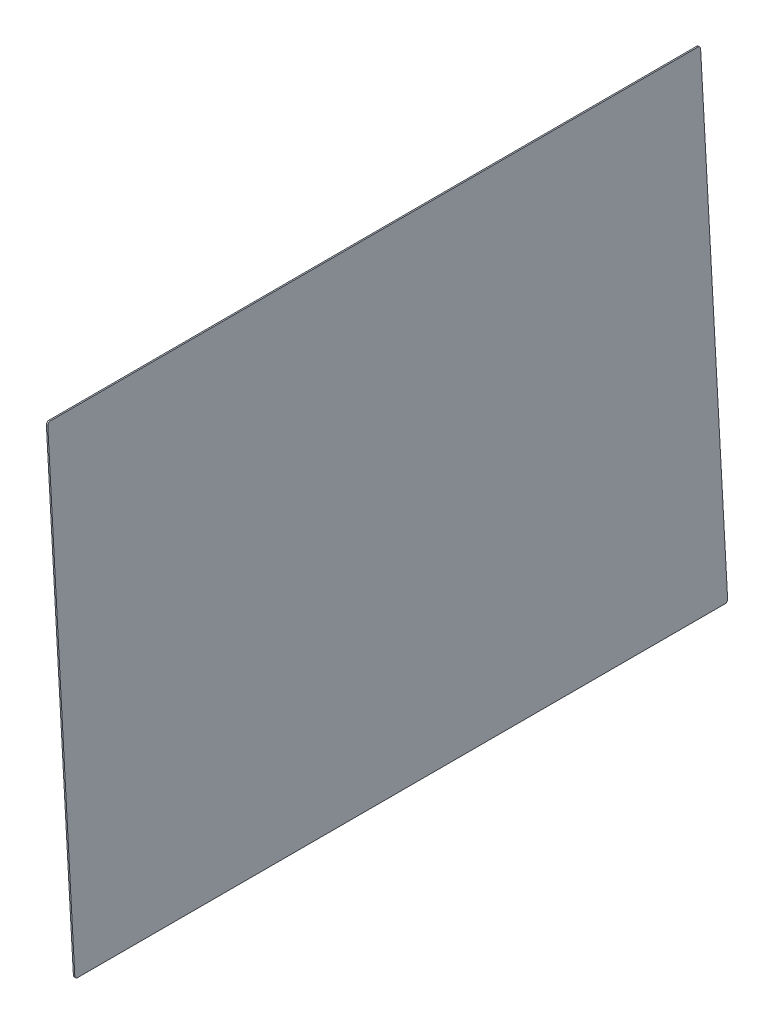
ISO-10303-21;
HEADER;
FILE_DESCRIPTION(('STEP AP214'),'2;1');
FILE_NAME('part.step','',(''),(''),'','','');
FILE_SCHEMA(('AUTOMOTIVE_DESIGN { 1 0 10303 214 1 1 1 1 }'));
ENDSEC;
DATA;
#1=APPLICATION_CONTEXT('core data for automotive mechanical design processes');
#2=APPLICATION_PROTOCOL_DEFINITION('international standard','automotive_design',2000,#1);
#3=PRODUCT_CONTEXT('',#1,'mechanical');
#4=PRODUCT('Part','Part','',(#3));
#5=PRODUCT_RELATED_PRODUCT_CATEGORY('part','',(#4));
#6=PRODUCT_DEFINITION_FORMATION('','',#4);
#7=PRODUCT_DEFINITION_CONTEXT('part definition',#1,'design');
#8=PRODUCT_DEFINITION('design','',#6,#7);
#9=PRODUCT_DEFINITION_SHAPE('','',#8);
#10=(LENGTH_UNIT() NAMED_UNIT(*) SI_UNIT(.MILLI.,.METRE.));
#11=(NAMED_UNIT(*) PLANE_ANGLE_UNIT() SI_UNIT($,.RADIAN.));
#12=(NAMED_UNIT(*) SI_UNIT($,.STERADIAN.) SOLID_ANGLE_UNIT());
#13=UNCERTAINTY_MEASURE_WITH_UNIT(LENGTH_MEASURE(1.E-05),#10,'distance_accuracy_value','');
#14=(GEOMETRIC_REPRESENTATION_CONTEXT(3) GLOBAL_UNCERTAINTY_ASSIGNED_CONTEXT((#13)) GLOBAL_UNIT_ASSIGNED_CONTEXT((#10,
#11,#12)) REPRESENTATION_CONTEXT('',''));
#15=CARTESIAN_POINT('',(0.,0.,0.));
#16=DIRECTION('',(0.,0.,1.));
#17=DIRECTION('',(1.,0.,0.));
#18=AXIS2_PLACEMENT_3D('',#15,#16,#17);
#19=CARTESIAN_POINT('',(-763.775566545537,-171.438463791411,-133.95));
#20=DIRECTION('',(0.998302940921257,0.0582343382204067,0.));
#21=DIRECTION('',(-0.0582343382204067,0.998302940921257,0.));
#22=AXIS2_PLACEMENT_3D('',#19,#20,#21);
#23=PLANE('',#22);
#24=DIRECTION('',(0.058234338220408,-0.998302940921257,0.));
#25=VECTOR('',#24,1.);
#26=CARTESIAN_POINT('',(-795.6297495521,374.633244892517,240.3));
#27=LINE('',#26,#25);
#28=CARTESIAN_POINT('',(-795.6297495521,374.633244892517,240.3));
#29=VERTEX_POINT('',#28);
#30=CARTESIAN_POINT('',(-764.649081618843,-156.463919677592,240.3));
#31=VERTEX_POINT('',#30);
#32=EDGE_CURVE('E112',#29,#31,#27,.T.);
#33=ORIENTED_EDGE('',*,*,#32,.T.);
#34=CARTESIAN_POINT('',(-764.649081618843,-156.463919677592,237.3));
#35=DIRECTION('',(0.998302940921257,0.0582343382204067,0.));
#36=DIRECTION('',(-0.0582343382204067,0.998302940921257,0.));
#37=AXIS2_PLACEMENT_3D('',#34,#35,#36);
#38=CIRCLE('',#37,3.);
#39=CARTESIAN_POINT('',(-764.474378604182,-159.458828500356,237.3));
#40=VERTEX_POINT('',#39);
#41=EDGE_CURVE('E138',#40,#31,#38,.F.);
#42=ORIENTED_EDGE('',*,*,#41,.F.);
#43=DIRECTION('',(0.,0.,1.));
#44=VECTOR('',#43,1.);
#45=CARTESIAN_POINT('',(-764.474378604182,-159.458828500356,-512.2));
#46=LINE('',#45,#44);
#47=CARTESIAN_POINT('',(-764.474378604182,-159.458828500356,-505.2));
#48=VERTEX_POINT('',#47);
#49=EDGE_CURVE('E92',#40,#48,#46,.F.);
#50=ORIENTED_EDGE('',*,*,#49,.T.);
#51=CARTESIAN_POINT('',(-764.649081618843,-156.463919677592,-505.2));
#52=DIRECTION('',(-0.998302940921257,-0.0582343382204067,0.));
#53=DIRECTION('',(0.0582343382204067,-0.998302940921257,0.));
#54=AXIS2_PLACEMENT_3D('',#51,#52,#53);
#55=CIRCLE('',#54,3.);
#56=CARTESIAN_POINT('',(-764.649081618843,-156.463919677592,-508.2));
#57=VERTEX_POINT('',#56);
#58=EDGE_CURVE('E19',#57,#48,#55,.T.);
#59=ORIENTED_EDGE('',*,*,#58,.F.);
#60=DIRECTION('',(-0.058234338220408,0.998302940921257,0.));
#61=VECTOR('',#60,1.);
#62=CARTESIAN_POINT('',(-764.649081618843,-156.463919677592,-508.2));
#63=LINE('',#62,#61);
#64=CARTESIAN_POINT('',(-795.6297495521,374.633244892517,-508.2));
#65=VERTEX_POINT('',#64);
#66=EDGE_CURVE('E78',#57,#65,#63,.T.);
#67=ORIENTED_EDGE('',*,*,#66,.T.);
#68=CARTESIAN_POINT('',(-795.6297495521,374.633244892517,-505.2));
#69=DIRECTION('',(0.998302940921257,0.0582343382204067,0.));
#70=DIRECTION('',(-0.0582343382204067,0.998302940921257,0.));
#71=AXIS2_PLACEMENT_3D('',#68,#69,#70);
#72=CIRCLE('',#71,3.);
#73=CARTESIAN_POINT('',(-795.804452566761,377.62815371528,-505.2));
#74=VERTEX_POINT('',#73);
#75=EDGE_CURVE('E105',#74,#65,#72,.F.);
#76=ORIENTED_EDGE('',*,*,#75,.F.);
#77=DIRECTION('',(0.,0.,1.));
#78=VECTOR('',#77,1.);
#79=CARTESIAN_POINT('',(-795.804452566761,377.62815371528,244.3));
#80=LINE('',#79,#78);
#81=CARTESIAN_POINT('',(-795.804452566761,377.62815371528,237.3));
#82=VERTEX_POINT('',#81);
#83=EDGE_CURVE('E117',#74,#82,#80,.T.);
#84=ORIENTED_EDGE('',*,*,#83,.T.);
#85=CARTESIAN_POINT('',(-795.6297495521,374.633244892517,237.3));
#86=DIRECTION('',(-0.998302940921257,-0.0582343382204067,0.));
#87=DIRECTION('',(0.0582343382204067,-0.998302940921257,0.));
#88=AXIS2_PLACEMENT_3D('',#85,#86,#87);
#89=CIRCLE('',#88,3.);
#90=EDGE_CURVE('E119',#29,#82,#89,.T.);
#91=ORIENTED_EDGE('',*,*,#90,.F.);
#92=EDGE_LOOP('',(#33,#42,#50,#59,#67,#76,#84,#91));
#93=FACE_BOUND('',#92,.T.);
#94=ADVANCED_FACE('F16',(#93),#23,.T.);
#95=CARTESIAN_POINT('',(-764.649081618843,-156.463919677592,-505.2));
#96=DIRECTION('',(-0.998302940921257,-0.0582343382204067,0.));
#97=DIRECTION('',(0.0582343382204067,-0.998302940921257,0.));
#98=AXIS2_PLACEMENT_3D('',#95,#96,#97);
#99=CYLINDRICAL_SURFACE('',#98,3.);
#100=DIRECTION('',(-0.998302940921257,-0.0582343382204067,0.));
#101=VECTOR('',#100,1.);
#102=CARTESIAN_POINT('',(-764.474378604182,-159.458828500356,-505.2));
#103=LINE('',#102,#101);
#104=CARTESIAN_POINT('',(-766.071663309656,-159.552003441509,-505.2));
#105=VERTEX_POINT('',#104);
#106=EDGE_CURVE('E111',#48,#105,#103,.T.);
#107=ORIENTED_EDGE('',*,*,#106,.T.);
#108=CARTESIAN_POINT('',(-766.246366324317,-156.557094618745,-505.2));
#109=DIRECTION('',(-0.998302940921257,-0.0582343382204067,0.));
#110=DIRECTION('',(0.0582343382204067,-0.998302940921257,0.));
#111=AXIS2_PLACEMENT_3D('',#108,#109,#110);
#112=CIRCLE('',#111,3.);
#113=CARTESIAN_POINT('',(-766.246366324317,-156.557094618745,-508.2));
#114=VERTEX_POINT('',#113);
#115=EDGE_CURVE('E99',#105,#114,#112,.F.);
#116=ORIENTED_EDGE('',*,*,#115,.T.);
#117=DIRECTION('',(0.998302940921248,0.0582343382205611,0.));
#118=VECTOR('',#117,1.);
#119=CARTESIAN_POINT('',(-766.246366324317,-156.557094618745,-508.2));
#120=LINE('',#119,#118);
#121=EDGE_CURVE('E83',#114,#57,#120,.T.);
#122=ORIENTED_EDGE('',*,*,#121,.T.);
#123=ORIENTED_EDGE('',*,*,#58,.T.);
#124=EDGE_LOOP('',(#107,#116,#122,#123));
#125=FACE_BOUND('',#124,.T.);
#126=ADVANCED_FACE('F98',(#125),#99,.T.);
#127=CARTESIAN_POINT('',(-796.386795948965,387.611183124493,-508.2));
#128=DIRECTION('',(0.,0.,1.));
#129=DIRECTION('',(1.,0.,0.));
#130=AXIS2_PLACEMENT_3D('',#127,#128,#129);
#131=PLANE('',#130);
#132=DIRECTION('',(-0.0582343382204067,0.998302940921257,0.));
#133=VECTOR('',#132,1.);
#134=CARTESIAN_POINT('',(-765.372851251011,-171.531638732564,-508.2));
#135=LINE('',#134,#133);
#136=CARTESIAN_POINT('',(-797.227034257574,374.540069951364,-508.2));
#137=VERTEX_POINT('',#136);
#138=EDGE_CURVE('E135',#114,#137,#135,.T.);
#139=ORIENTED_EDGE('',*,*,#138,.T.);
#140=DIRECTION('',(0.998302940921257,0.0582343382204067,0.));
#141=VECTOR('',#140,1.);
#142=CARTESIAN_POINT('',(-795.6297495521,374.633244892517,-508.2));
#143=LINE('',#142,#141);
#144=EDGE_CURVE('E85',#65,#137,#143,.F.);
#145=ORIENTED_EDGE('',*,*,#144,.F.);
#146=ORIENTED_EDGE('',*,*,#66,.F.);
#147=ORIENTED_EDGE('',*,*,#121,.F.);
#148=EDGE_LOOP('',(#139,#145,#146,#147));
#149=FACE_BOUND('',#148,.T.);
#150=ADVANCED_FACE('F81',(#149),#131,.F.);
#151=CARTESIAN_POINT('',(-795.6297495521,374.633244892517,-505.2));
#152=DIRECTION('',(0.998302940921257,0.0582343382204067,0.));
#153=DIRECTION('',(-0.0582343382204067,0.998302940921257,0.));
#154=AXIS2_PLACEMENT_3D('',#151,#152,#153);
#155=CYLINDRICAL_SURFACE('',#154,3.);
#156=DIRECTION('',(0.998302940921257,0.0582343382204067,0.));
#157=VECTOR('',#156,1.);
#158=CARTESIAN_POINT('',(-795.804452566761,377.62815371528,-505.2));
#159=LINE('',#158,#157);
#160=CARTESIAN_POINT('',(-797.401737272235,377.534978774128,-505.2));
#161=VERTEX_POINT('',#160);
#162=EDGE_CURVE('E120',#161,#74,#159,.T.);
#163=ORIENTED_EDGE('',*,*,#162,.T.);
#164=ORIENTED_EDGE('',*,*,#75,.T.);
#165=ORIENTED_EDGE('',*,*,#144,.T.);
#166=CARTESIAN_POINT('',(-797.227034257574,374.540069951364,-505.2));
#167=DIRECTION('',(0.998302940921257,0.0582343382204067,0.));
#168=DIRECTION('',(-0.0582343382204067,0.998302940921257,0.));
#169=AXIS2_PLACEMENT_3D('',#166,#167,#168);
#170=CIRCLE('',#169,3.);
#171=EDGE_CURVE('E131',#137,#161,#170,.T.);
#172=ORIENTED_EDGE('',*,*,#171,.T.);
#173=EDGE_LOOP('',(#163,#164,#165,#172));
#174=FACE_BOUND('',#173,.T.);
#175=ADVANCED_FACE('F184',(#174),#155,.T.);
#176=CARTESIAN_POINT('',(-795.804452566761,377.62815371528,244.3));
#177=DIRECTION('',(0.0582343382204067,-0.998302940921257,0.));
#178=DIRECTION('',(0.998302940921257,0.0582343382204067,0.));
#179=AXIS2_PLACEMENT_3D('',#176,#177,#178);
#180=PLANE('',#179);
#181=ORIENTED_EDGE('',*,*,#162,.F.);
#182=DIRECTION('',(0.,0.,1.));
#183=VECTOR('',#182,1.);
#184=CARTESIAN_POINT('',(-797.401737272235,377.534978774128,-133.95));
#185=LINE('',#184,#183);
#186=CARTESIAN_POINT('',(-797.401737272235,377.534978774128,237.3));
#187=VERTEX_POINT('',#186);
#188=EDGE_CURVE('E130',#161,#187,#185,.T.);
#189=ORIENTED_EDGE('',*,*,#188,.T.);
#190=DIRECTION('',(-0.998302940921257,-0.0582343382204067,0.));
#191=VECTOR('',#190,1.);
#192=CARTESIAN_POINT('',(-795.804452566761,377.628153715281,237.3));
#193=LINE('',#192,#191);
#194=EDGE_CURVE('E143',#82,#187,#193,.T.);
#195=ORIENTED_EDGE('',*,*,#194,.F.);
#196=ORIENTED_EDGE('',*,*,#83,.F.);
#197=EDGE_LOOP('',(#181,#189,#195,#196));
#198=FACE_BOUND('',#197,.T.);
#199=ADVANCED_FACE('F182',(#198),#180,.F.);
#200=CARTESIAN_POINT('',(-795.6297495521,374.633244892517,237.3));
#201=DIRECTION('',(-0.998302940921257,-0.0582343382204067,0.));
#202=DIRECTION('',(0.0582343382204067,-0.998302940921257,0.));
#203=AXIS2_PLACEMENT_3D('',#200,#201,#202);
#204=CYLINDRICAL_SURFACE('',#203,3.);
#205=ORIENTED_EDGE('',*,*,#194,.T.);
#206=CARTESIAN_POINT('',(-797.227034257574,374.540069951364,237.3));
#207=DIRECTION('',(-0.998302940921257,-0.0582343382204067,0.));
#208=DIRECTION('',(0.0582343382204067,-0.998302940921257,0.));
#209=AXIS2_PLACEMENT_3D('',#206,#207,#208);
#210=CIRCLE('',#209,3.);
#211=CARTESIAN_POINT('',(-797.227034257574,374.540069951364,240.3));
#212=VERTEX_POINT('',#211);
#213=EDGE_CURVE('E126',#187,#212,#210,.F.);
#214=ORIENTED_EDGE('',*,*,#213,.T.);
#215=DIRECTION('',(0.998302940921244,0.0582343382206343,0.));
#216=VECTOR('',#215,1.);
#217=CARTESIAN_POINT('',(-797.227034257574,374.540069951364,240.3));
#218=LINE('',#217,#216);
#219=EDGE_CURVE('E116',#212,#29,#218,.T.);
#220=ORIENTED_EDGE('',*,*,#219,.T.);
#221=ORIENTED_EDGE('',*,*,#90,.T.);
#222=EDGE_LOOP('',(#205,#214,#220,#221));
#223=FACE_BOUND('',#222,.T.);
#224=ADVANCED_FACE('F178',(#223),#204,.T.);
#225=CARTESIAN_POINT('',(-762.902051472231,-186.41300790523,240.3));
#226=DIRECTION('',(0.,0.,-1.));
#227=DIRECTION('',(-1.,0.,0.));
#228=AXIS2_PLACEMENT_3D('',#225,#226,#227);
#229=PLANE('',#228);
#230=ORIENTED_EDGE('',*,*,#32,.F.);
#231=ORIENTED_EDGE('',*,*,#219,.F.);
#232=DIRECTION('',(-0.0582343382204067,0.998302940921257,0.));
#233=VECTOR('',#232,1.);
#234=CARTESIAN_POINT('',(-765.372851251011,-171.531638732564,240.3));
#235=LINE('',#234,#233);
#236=CARTESIAN_POINT('',(-766.246366324317,-156.557094618745,240.3));
#237=VERTEX_POINT('',#236);
#238=EDGE_CURVE('E125',#212,#237,#235,.F.);
#239=ORIENTED_EDGE('',*,*,#238,.T.);
#240=DIRECTION('',(0.998302940921257,0.0582343382204067,0.));
#241=VECTOR('',#240,1.);
#242=CARTESIAN_POINT('',(-764.649081618843,-156.463919677592,240.3));
#243=LINE('',#242,#241);
#244=EDGE_CURVE('E115',#31,#237,#243,.F.);
#245=ORIENTED_EDGE('',*,*,#244,.F.);
#246=EDGE_LOOP('',(#230,#231,#239,#245));
#247=FACE_BOUND('',#246,.T.);
#248=ADVANCED_FACE('F171',(#247),#229,.F.);
#249=CARTESIAN_POINT('',(-764.649081618843,-156.463919677592,237.3));
#250=DIRECTION('',(0.998302940921257,0.0582343382204067,0.));
#251=DIRECTION('',(-0.0582343382204067,0.998302940921257,0.));
#252=AXIS2_PLACEMENT_3D('',#249,#250,#251);
#253=CYLINDRICAL_SURFACE('',#252,3.);
#254=DIRECTION('',(-0.998302940921257,-0.0582343382204067,0.));
#255=VECTOR('',#254,1.);
#256=CARTESIAN_POINT('',(-764.474378604182,-159.458828500356,237.3));
#257=LINE('',#256,#255);
#258=CARTESIAN_POINT('',(-766.071663309656,-159.552003441509,237.3));
#259=VERTEX_POINT('',#258);
#260=EDGE_CURVE('E34',#259,#40,#257,.F.);
#261=ORIENTED_EDGE('',*,*,#260,.T.);
#262=ORIENTED_EDGE('',*,*,#41,.T.);
#263=ORIENTED_EDGE('',*,*,#244,.T.);
#264=CARTESIAN_POINT('',(-766.246366324317,-156.557094618745,237.3));
#265=DIRECTION('',(0.998302940921257,0.0582343382204067,0.));
#266=DIRECTION('',(-0.0582343382204067,0.998302940921257,0.));
#267=AXIS2_PLACEMENT_3D('',#264,#265,#266);
#268=CIRCLE('',#267,3.);
#269=EDGE_CURVE('E26',#237,#259,#268,.T.);
#270=ORIENTED_EDGE('',*,*,#269,.T.);
#271=EDGE_LOOP('',(#261,#262,#263,#270));
#272=FACE_BOUND('',#271,.T.);
#273=ADVANCED_FACE('F198',(#272),#253,.T.);
#274=CARTESIAN_POINT('',(-764.474378604182,-159.458828500356,-512.2));
#275=DIRECTION('',(-0.0582343382204067,0.998302940921257,0.));
#276=DIRECTION('',(-0.998302940921257,-0.0582343382204067,0.));
#277=AXIS2_PLACEMENT_3D('',#274,#275,#276);
#278=PLANE('',#277);
#279=ORIENTED_EDGE('',*,*,#106,.F.);
#280=ORIENTED_EDGE('',*,*,#49,.F.);
#281=ORIENTED_EDGE('',*,*,#260,.F.);
#282=DIRECTION('',(0.,0.,1.));
#283=VECTOR('',#282,1.);
#284=CARTESIAN_POINT('',(-766.071663309656,-159.552003441509,-133.95));
#285=LINE('',#284,#283);
#286=EDGE_CURVE('E11',#259,#105,#285,.F.);
#287=ORIENTED_EDGE('',*,*,#286,.T.);
#288=EDGE_LOOP('',(#279,#280,#281,#287));
#289=FACE_BOUND('',#288,.T.);
#290=ADVANCED_FACE('F194',(#289),#278,.F.);
#291=CARTESIAN_POINT('',(-765.372851251011,-171.531638732564,-133.95));
#292=DIRECTION('',(0.998302940921257,0.0582343382204067,0.));
#293=DIRECTION('',(-0.0582343382204067,0.998302940921257,0.));
#294=AXIS2_PLACEMENT_3D('',#291,#292,#293);
#295=PLANE('',#294);
#296=ORIENTED_EDGE('',*,*,#269,.F.);
#297=ORIENTED_EDGE('',*,*,#238,.F.);
#298=ORIENTED_EDGE('',*,*,#213,.F.);
#299=ORIENTED_EDGE('',*,*,#188,.F.);
#300=ORIENTED_EDGE('',*,*,#171,.F.);
#301=ORIENTED_EDGE('',*,*,#138,.F.);
#302=ORIENTED_EDGE('',*,*,#115,.F.);
#303=ORIENTED_EDGE('',*,*,#286,.F.);
#304=EDGE_LOOP('',(#296,#297,#298,#299,#300,#301,#302,#303));
#305=FACE_BOUND('',#304,.T.);
#306=ADVANCED_FACE('F175',(#305),#295,.F.);
#307=CLOSED_SHELL('',(#94,#126,#150,#175,#199,#224,#248,#273,#290,#306));
#308=MANIFOLD_SOLID_BREP('B1',#307);
#309=ADVANCED_BREP_SHAPE_REPRESENTATION('',(#18,#308),#14);
#310=SHAPE_DEFINITION_REPRESENTATION(#9,#309);
ENDSEC;
END-ISO-10303-21;
